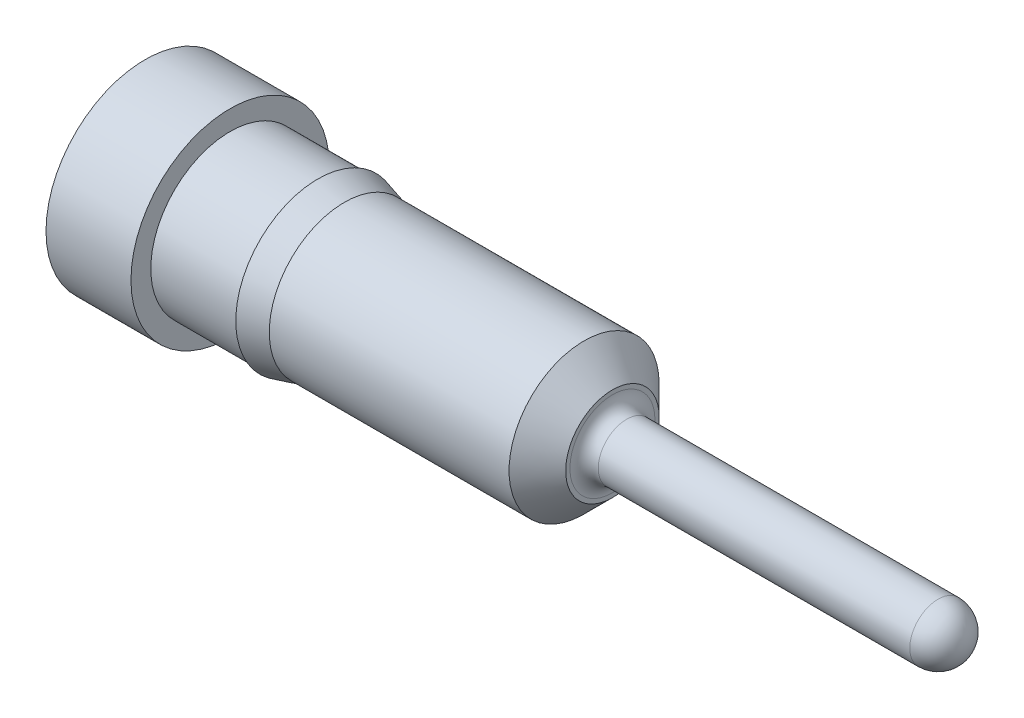
ISO-10303-21;
HEADER;
FILE_DESCRIPTION(('STEP AP214'),'2;1');
FILE_NAME('part.step','',(''),(''),'','','');
FILE_SCHEMA(('AUTOMOTIVE_DESIGN { 1 0 10303 214 1 1 1 1 }'));
ENDSEC;
DATA;
#1=APPLICATION_CONTEXT('core data for automotive mechanical design processes');
#2=APPLICATION_PROTOCOL_DEFINITION('international standard','automotive_design',2000,#1);
#3=PRODUCT_CONTEXT('',#1,'mechanical');
#4=PRODUCT('Part','Part','',(#3));
#5=PRODUCT_RELATED_PRODUCT_CATEGORY('part','',(#4));
#6=PRODUCT_DEFINITION_FORMATION('','',#4);
#7=PRODUCT_DEFINITION_CONTEXT('part definition',#1,'design');
#8=PRODUCT_DEFINITION('design','',#6,#7);
#9=PRODUCT_DEFINITION_SHAPE('','',#8);
#10=(LENGTH_UNIT() NAMED_UNIT(*) SI_UNIT(.MILLI.,.METRE.));
#11=(NAMED_UNIT(*) PLANE_ANGLE_UNIT() SI_UNIT($,.RADIAN.));
#12=(NAMED_UNIT(*) SI_UNIT($,.STERADIAN.) SOLID_ANGLE_UNIT());
#13=UNCERTAINTY_MEASURE_WITH_UNIT(LENGTH_MEASURE(1.E-05),#10,'distance_accuracy_value','');
#14=(GEOMETRIC_REPRESENTATION_CONTEXT(3) GLOBAL_UNCERTAINTY_ASSIGNED_CONTEXT((#13)) GLOBAL_UNIT_ASSIGNED_CONTEXT((#10,
#11,#12)) REPRESENTATION_CONTEXT('',''));
#15=CARTESIAN_POINT('',(0.,0.,0.));
#16=DIRECTION('',(0.,0.,1.));
#17=DIRECTION('',(1.,0.,0.));
#18=AXIS2_PLACEMENT_3D('',#15,#16,#17);
#19=CARTESIAN_POINT('',(4.19099999999997,0.,0.));
#20=DIRECTION('',(-1.,0.,0.));
#21=DIRECTION('',(0.,0.,-1.));
#22=AXIS2_PLACEMENT_3D('',#19,#20,#21);
#23=CONICAL_SURFACE('',#22,0.419099999999965,0.785398163397482);
#24=CARTESIAN_POINT('',(3.93699999999997,0.,0.));
#25=DIRECTION('',(1.,0.,0.));
#26=DIRECTION('',(0.,0.,-1.));
#27=AXIS2_PLACEMENT_3D('',#24,#25,#26);
#28=CIRCLE('',#27,0.673099999999982);
#29=CARTESIAN_POINT('',(3.93699999999997,0.,-0.673099999999982));
#30=VERTEX_POINT('',#29);
#31=EDGE_CURVE('E11',#30,#30,#28,.T.);
#32=ORIENTED_EDGE('',*,*,#31,.T.);
#33=EDGE_LOOP('',(#32));
#34=FACE_BOUND('',#33,.T.);
#35=CARTESIAN_POINT('',(4.19099999999997,0.,0.));
#36=DIRECTION('',(1.,0.,0.));
#37=DIRECTION('',(0.,0.,-1.));
#38=AXIS2_PLACEMENT_3D('',#35,#36,#37);
#39=CIRCLE('',#38,0.419099999999965);
#40=CARTESIAN_POINT('',(4.19099999999997,0.,-0.419099999999965));
#41=VERTEX_POINT('',#40);
#42=EDGE_CURVE('E56',#41,#41,#39,.T.);
#43=ORIENTED_EDGE('',*,*,#42,.F.);
#44=EDGE_LOOP('',(#43));
#45=FACE_BOUND('',#44,.T.);
#46=ADVANCED_FACE('F37',(#34,#45),#23,.T.);
#47=CARTESIAN_POINT('',(0.,0.,0.));
#48=DIRECTION('',(-1.,0.,0.));
#49=DIRECTION('',(0.,0.,-1.));
#50=AXIS2_PLACEMENT_3D('',#47,#48,#49);
#51=CYLINDRICAL_SURFACE('',#50,0.673099999999982);
#52=CARTESIAN_POINT('',(1.78638522628082,0.,0.));
#53=DIRECTION('',(1.,0.,0.));
#54=DIRECTION('',(0.,0.,-1.));
#55=AXIS2_PLACEMENT_3D('',#52,#53,#54);
#56=CIRCLE('',#55,0.673099999999982);
#57=CARTESIAN_POINT('',(1.78638522628082,0.,-0.673099999999982));
#58=VERTEX_POINT('',#57);
#59=EDGE_CURVE('E43',#58,#58,#56,.T.);
#60=ORIENTED_EDGE('',*,*,#59,.T.);
#61=EDGE_LOOP('',(#60));
#62=FACE_BOUND('',#61,.T.);
#63=ORIENTED_EDGE('',*,*,#31,.F.);
#64=EDGE_LOOP('',(#63));
#65=FACE_BOUND('',#64,.T.);
#66=ADVANCED_FACE('F90',(#62,#65),#51,.T.);
#67=CARTESIAN_POINT('',(1.78638522628082,0.,0.));
#68=DIRECTION('',(-1.,0.,0.));
#69=DIRECTION('',(0.,0.,-1.));
#70=AXIS2_PLACEMENT_3D('',#67,#68,#69);
#71=CONICAL_SURFACE('',#70,0.673099999999982,0.261799387799026);
#72=CARTESIAN_POINT('',(1.54939999999999,0.,0.));
#73=DIRECTION('',(1.,0.,0.));
#74=DIRECTION('',(0.,0.,-1.));
#75=AXIS2_PLACEMENT_3D('',#72,#73,#74);
#76=CIRCLE('',#75,0.736600000000004);
#77=CARTESIAN_POINT('',(1.54939999999999,0.,-0.736600000000004));
#78=VERTEX_POINT('',#77);
#79=EDGE_CURVE('E85',#78,#78,#76,.T.);
#80=ORIENTED_EDGE('',*,*,#79,.T.);
#81=EDGE_LOOP('',(#80));
#82=FACE_BOUND('',#81,.T.);
#83=ORIENTED_EDGE('',*,*,#59,.F.);
#84=EDGE_LOOP('',(#83));
#85=FACE_BOUND('',#84,.T.);
#86=ADVANCED_FACE('F93',(#82,#85),#71,.T.);
#87=CARTESIAN_POINT('',(1.54939999999999,0.7112,0.));
#88=DIRECTION('',(1.,0.,0.));
#89=DIRECTION('',(0.,0.,1.));
#90=AXIS2_PLACEMENT_3D('',#87,#88,#89);
#91=PLANE('',#90);
#92=CARTESIAN_POINT('',(1.54939999999999,0.,0.));
#93=DIRECTION('',(1.,0.,0.));
#94=DIRECTION('',(0.,0.,-1.));
#95=AXIS2_PLACEMENT_3D('',#92,#93,#94);
#96=CIRCLE('',#95,0.7112);
#97=CARTESIAN_POINT('',(1.54939999999999,0.,-0.7112));
#98=VERTEX_POINT('',#97);
#99=EDGE_CURVE('E82',#98,#98,#96,.T.);
#100=ORIENTED_EDGE('',*,*,#99,.T.);
#101=EDGE_LOOP('',(#100));
#102=FACE_BOUND('',#101,.T.);
#103=ORIENTED_EDGE('',*,*,#79,.F.);
#104=EDGE_LOOP('',(#103));
#105=FACE_BOUND('',#104,.T.);
#106=ADVANCED_FACE('F95',(#102,#105),#91,.F.);
#107=CARTESIAN_POINT('',(0.,0.,0.));
#108=DIRECTION('',(-1.,0.,0.));
#109=DIRECTION('',(0.,0.,-1.));
#110=AXIS2_PLACEMENT_3D('',#107,#108,#109);
#111=CYLINDRICAL_SURFACE('',#110,0.7112);
#112=CARTESIAN_POINT('',(0.761999999999971,0.,0.));
#113=DIRECTION('',(1.,0.,0.));
#114=DIRECTION('',(0.,0.,-1.));
#115=AXIS2_PLACEMENT_3D('',#112,#113,#114);
#116=CIRCLE('',#115,0.7112);
#117=CARTESIAN_POINT('',(0.761999999999971,0.,-0.7112));
#118=VERTEX_POINT('',#117);
#119=EDGE_CURVE('E79',#118,#118,#116,.T.);
#120=ORIENTED_EDGE('',*,*,#119,.T.);
#121=EDGE_LOOP('',(#120));
#122=FACE_BOUND('',#121,.T.);
#123=ORIENTED_EDGE('',*,*,#99,.F.);
#124=EDGE_LOOP('',(#123));
#125=FACE_BOUND('',#124,.T.);
#126=ADVANCED_FACE('F102',(#122,#125),#111,.T.);
#127=CARTESIAN_POINT('',(0.761999999999985,0.888999999999945,0.));
#128=DIRECTION('',(-1.,0.,0.));
#129=DIRECTION('',(0.,0.,-1.));
#130=AXIS2_PLACEMENT_3D('',#127,#128,#129);
#131=PLANE('',#130);
#132=CARTESIAN_POINT('',(0.761999999999999,0.,0.));
#133=DIRECTION('',(1.,0.,0.));
#134=DIRECTION('',(0.,0.,-1.));
#135=AXIS2_PLACEMENT_3D('',#132,#133,#134);
#136=CIRCLE('',#135,0.888999999999945);
#137=CARTESIAN_POINT('',(0.761999999999999,0.,-0.888999999999945));
#138=VERTEX_POINT('',#137);
#139=EDGE_CURVE('E76',#138,#138,#136,.T.);
#140=ORIENTED_EDGE('',*,*,#139,.T.);
#141=EDGE_LOOP('',(#140));
#142=FACE_BOUND('',#141,.T.);
#143=ORIENTED_EDGE('',*,*,#119,.F.);
#144=EDGE_LOOP('',(#143));
#145=FACE_BOUND('',#144,.T.);
#146=ADVANCED_FACE('F143',(#142,#145),#131,.F.);
#147=CARTESIAN_POINT('',(0.,0.,0.));
#148=DIRECTION('',(-1.,0.,0.));
#149=DIRECTION('',(0.,0.,-1.));
#150=AXIS2_PLACEMENT_3D('',#147,#148,#149);
#151=CYLINDRICAL_SURFACE('',#150,0.888999999999945);
#152=CARTESIAN_POINT('',(0.,0.,0.));
#153=DIRECTION('',(1.,0.,0.));
#154=DIRECTION('',(0.,0.,-1.));
#155=AXIS2_PLACEMENT_3D('',#152,#153,#154);
#156=CIRCLE('',#155,0.888999999999945);
#157=CARTESIAN_POINT('',(0.,0.,-0.888999999999945));
#158=VERTEX_POINT('',#157);
#159=EDGE_CURVE('E73',#158,#158,#156,.T.);
#160=ORIENTED_EDGE('',*,*,#159,.T.);
#161=EDGE_LOOP('',(#160));
#162=FACE_BOUND('',#161,.T.);
#163=ORIENTED_EDGE('',*,*,#139,.F.);
#164=EDGE_LOOP('',(#163));
#165=FACE_BOUND('',#164,.T.);
#166=ADVANCED_FACE('F137',(#162,#165),#151,.T.);
#167=CARTESIAN_POINT('',(0.,0.,0.));
#168=DIRECTION('',(1.,0.,0.));
#169=DIRECTION('',(0.,0.,1.));
#170=AXIS2_PLACEMENT_3D('',#167,#168,#169);
#171=PLANE('',#170);
#172=CARTESIAN_POINT('',(0.,0.,0.));
#173=DIRECTION('',(1.,0.,0.));
#174=DIRECTION('',(0.,0.,-1.));
#175=AXIS2_PLACEMENT_3D('',#172,#173,#174);
#176=CIRCLE('',#175,0.812800000000001);
#177=CARTESIAN_POINT('',(0.,0.,-0.812800000000001));
#178=VERTEX_POINT('',#177);
#179=EDGE_CURVE('E57',#178,#178,#176,.T.);
#180=ORIENTED_EDGE('',*,*,#179,.T.);
#181=EDGE_LOOP('',(#180));
#182=FACE_BOUND('',#181,.T.);
#183=ORIENTED_EDGE('',*,*,#159,.F.);
#184=EDGE_LOOP('',(#183));
#185=FACE_BOUND('',#184,.T.);
#186=ADVANCED_FACE('F132',(#182,#185),#171,.F.);
#187=CARTESIAN_POINT('',(7.11200000000001,0.,0.));
#188=DIRECTION('',(-1.,0.,0.));
#189=DIRECTION('',(0.,1.,0.));
#190=AXIS2_PLACEMENT_3D('',#187,#188,#189);
#191=SPHERICAL_SURFACE('',#190,0.254000000000004);
#192=CARTESIAN_POINT('',(7.11200000000001,0.,0.));
#193=DIRECTION('',(1.,0.,0.));
#194=DIRECTION('',(0.,0.,-1.));
#195=AXIS2_PLACEMENT_3D('',#192,#193,#194);
#196=CIRCLE('',#195,0.253999999999976);
#197=CARTESIAN_POINT('',(7.11200000000001,0.,-0.253999999999976));
#198=VERTEX_POINT('',#197);
#199=EDGE_CURVE('E70',#198,#198,#196,.T.);
#200=ORIENTED_EDGE('',*,*,#199,.T.);
#201=EDGE_LOOP('',(#200));
#202=FACE_BOUND('',#201,.T.);
#203=ADVANCED_FACE('F127',(#202),#191,.T.);
#204=CARTESIAN_POINT('',(0.,0.,0.));
#205=DIRECTION('',(-1.,0.,0.));
#206=DIRECTION('',(0.,0.,-1.));
#207=AXIS2_PLACEMENT_3D('',#204,#205,#206);
#208=CYLINDRICAL_SURFACE('',#207,0.253999999999976);
#209=CARTESIAN_POINT('',(4.31799999999997,0.,0.));
#210=DIRECTION('',(1.,0.,0.));
#211=DIRECTION('',(0.,0.,-1.));
#212=AXIS2_PLACEMENT_3D('',#209,#210,#211);
#213=CIRCLE('',#212,0.253999999999976);
#214=CARTESIAN_POINT('',(4.31799999999997,0.,-0.253999999999976));
#215=VERTEX_POINT('',#214);
#216=EDGE_CURVE('E67',#215,#215,#213,.T.);
#217=ORIENTED_EDGE('',*,*,#216,.T.);
#218=EDGE_LOOP('',(#217));
#219=FACE_BOUND('',#218,.T.);
#220=ORIENTED_EDGE('',*,*,#199,.F.);
#221=EDGE_LOOP('',(#220));
#222=FACE_BOUND('',#221,.T.);
#223=ADVANCED_FACE('F121',(#219,#222),#208,.T.);
#224=CARTESIAN_POINT('',(4.31799999999997,0.,0.));
#225=DIRECTION('',(-1.,0.,0.));
#226=DIRECTION('',(0.,0.,-1.));
#227=AXIS2_PLACEMENT_3D('',#224,#225,#226);
#228=TOROIDAL_SURFACE('',#227,0.380999999999976,0.127);
#229=CARTESIAN_POINT('',(4.19099999999997,0.,0.));
#230=DIRECTION('',(1.,0.,0.));
#231=DIRECTION('',(0.,0.,-1.));
#232=AXIS2_PLACEMENT_3D('',#229,#230,#231);
#233=CIRCLE('',#232,0.380999999999976);
#234=CARTESIAN_POINT('',(4.19099999999997,0.,-0.380999999999976));
#235=VERTEX_POINT('',#234);
#236=EDGE_CURVE('E60',#235,#235,#233,.T.);
#237=ORIENTED_EDGE('',*,*,#236,.T.);
#238=EDGE_LOOP('',(#237));
#239=FACE_BOUND('',#238,.T.);
#240=ORIENTED_EDGE('',*,*,#216,.F.);
#241=EDGE_LOOP('',(#240));
#242=FACE_BOUND('',#241,.T.);
#243=ADVANCED_FACE('F115',(#239,#242),#228,.F.);
#244=CARTESIAN_POINT('',(4.19099999999997,0.419099999999965,0.));
#245=DIRECTION('',(-1.,0.,0.));
#246=DIRECTION('',(0.,0.,-1.));
#247=AXIS2_PLACEMENT_3D('',#244,#245,#246);
#248=PLANE('',#247);
#249=ORIENTED_EDGE('',*,*,#42,.T.);
#250=EDGE_LOOP('',(#249));
#251=FACE_BOUND('',#250,.T.);
#252=ORIENTED_EDGE('',*,*,#236,.F.);
#253=EDGE_LOOP('',(#252));
#254=FACE_BOUND('',#253,.T.);
#255=ADVANCED_FACE('F50',(#251,#254),#248,.F.);
#256=CARTESIAN_POINT('',(0.000254000000000001,0.,0.));
#257=DIRECTION('',(-1.,0.,0.));
#258=DIRECTION('',(0.,0.,-1.));
#259=AXIS2_PLACEMENT_3D('',#256,#257,#258);
#260=CONICAL_SURFACE('',#259,0.8128,1.15191730631626);
#261=CARTESIAN_POINT('',(0.362135875418775,0.,0.));
#262=VERTEX_POINT('',#261);
#263=VERTEX_LOOP('',#262);
#264=FACE_BOUND('',#263,.T.);
#265=CARTESIAN_POINT('',(0.000254000000000001,0.,0.));
#266=DIRECTION('',(1.,0.,0.));
#267=DIRECTION('',(0.,0.,-1.));
#268=AXIS2_PLACEMENT_3D('',#265,#266,#267);
#269=CIRCLE('',#268,0.8128);
#270=CARTESIAN_POINT('',(0.000254000000000001,0.,-0.8128));
#271=VERTEX_POINT('',#270);
#272=EDGE_CURVE('E54',#271,#271,#269,.T.);
#273=ORIENTED_EDGE('',*,*,#272,.F.);
#274=EDGE_LOOP('',(#273));
#275=FACE_BOUND('',#274,.T.);
#276=ADVANCED_FACE('F46',(#264,#275),#260,.F.);
#277=CARTESIAN_POINT('',(0.,0.,0.));
#278=DIRECTION('',(-1.,0.,0.));
#279=DIRECTION('',(0.,0.,-1.));
#280=AXIS2_PLACEMENT_3D('',#277,#278,#279);
#281=CYLINDRICAL_SURFACE('',#280,0.8128);
#282=ORIENTED_EDGE('',*,*,#272,.T.);
#283=EDGE_LOOP('',(#282));
#284=FACE_BOUND('',#283,.T.);
#285=ORIENTED_EDGE('',*,*,#179,.F.);
#286=EDGE_LOOP('',(#285));
#287=FACE_BOUND('',#286,.T.);
#288=ADVANCED_FACE('F49',(#284,#287),#281,.F.);
#289=CLOSED_SHELL('',(#46,#66,#86,#106,#126,#146,#166,#186,#203,#223,#243,#255,#276,#288));
#290=MANIFOLD_SOLID_BREP('B2',#289);
#291=ADVANCED_BREP_SHAPE_REPRESENTATION('',(#18,#290),#14);
#292=SHAPE_DEFINITION_REPRESENTATION(#9,#291);
ENDSEC;
END-ISO-10303-21;
